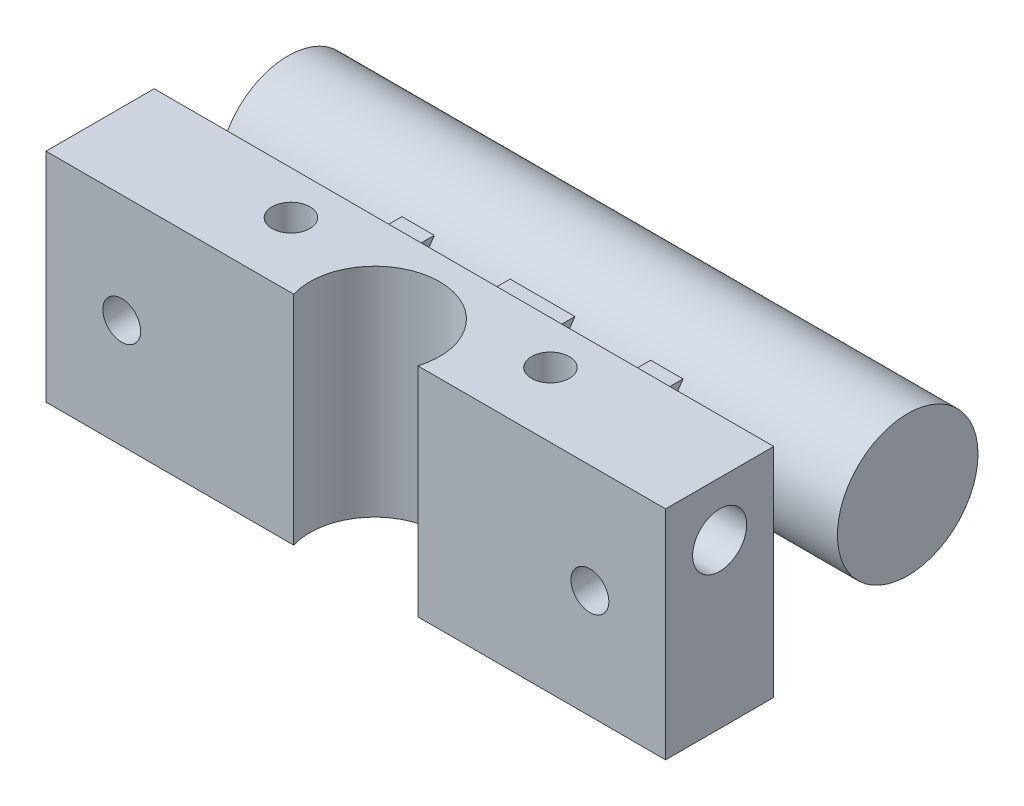
ISO-10303-21;
HEADER;
FILE_DESCRIPTION(('STEP AP214'),'2;1');
FILE_NAME('part.step','',(''),(''),'','','');
FILE_SCHEMA(('AUTOMOTIVE_DESIGN { 1 0 10303 214 1 1 1 1 }'));
ENDSEC;
DATA;
#1=APPLICATION_CONTEXT('core data for automotive mechanical design processes');
#2=APPLICATION_PROTOCOL_DEFINITION('international standard','automotive_design',2000,#1);
#3=PRODUCT_CONTEXT('',#1,'mechanical');
#4=PRODUCT('Part','Part','',(#3));
#5=PRODUCT_RELATED_PRODUCT_CATEGORY('part','',(#4));
#6=PRODUCT_DEFINITION_FORMATION('','',#4);
#7=PRODUCT_DEFINITION_CONTEXT('part definition',#1,'design');
#8=PRODUCT_DEFINITION('design','',#6,#7);
#9=PRODUCT_DEFINITION_SHAPE('','',#8);
#10=(LENGTH_UNIT() NAMED_UNIT(*) SI_UNIT(.MILLI.,.METRE.));
#11=(NAMED_UNIT(*) PLANE_ANGLE_UNIT() SI_UNIT($,.RADIAN.));
#12=(NAMED_UNIT(*) SI_UNIT($,.STERADIAN.) SOLID_ANGLE_UNIT());
#13=UNCERTAINTY_MEASURE_WITH_UNIT(LENGTH_MEASURE(1.E-05),#10,'distance_accuracy_value','');
#14=(GEOMETRIC_REPRESENTATION_CONTEXT(3) GLOBAL_UNCERTAINTY_ASSIGNED_CONTEXT((#13)) GLOBAL_UNIT_ASSIGNED_CONTEXT((#10,
#11,#12)) REPRESENTATION_CONTEXT('',''));
#15=CARTESIAN_POINT('',(0.,0.,0.));
#16=DIRECTION('',(0.,0.,1.));
#17=DIRECTION('',(1.,0.,0.));
#18=AXIS2_PLACEMENT_3D('',#15,#16,#17);
#19=CARTESIAN_POINT('',(-13.,4.,-30.));
#20=DIRECTION('',(0.,-1.,0.));
#21=DIRECTION('',(1.,0.,0.));
#22=AXIS2_PLACEMENT_3D('',#19,#20,#21);
#23=PLANE('',#22);
#24=DIRECTION('',(-1.,0.,0.));
#25=VECTOR('',#24,1.);
#26=CARTESIAN_POINT('',(28.65,3.99999999999999,-17.2665246170202));
#27=LINE('',#26,#25);
#28=CARTESIAN_POINT('',(-13.,4.,-17.2665246170202));
#29=VERTEX_POINT('',#28);
#30=CARTESIAN_POINT('',(-10.,4.,-17.2665246170202));
#31=VERTEX_POINT('',#30);
#32=EDGE_CURVE('E93',#29,#31,#27,.F.);
#33=ORIENTED_EDGE('',*,*,#32,.F.);
#34=DIRECTION('',(0.,0.,1.));
#35=VECTOR('',#34,1.);
#36=CARTESIAN_POINT('',(-13.,4.,-30.));
#37=LINE('',#36,#35);
#38=CARTESIAN_POINT('',(-13.,4.,-10.));
#39=VERTEX_POINT('',#38);
#40=EDGE_CURVE('E315',#29,#39,#37,.T.);
#41=ORIENTED_EDGE('',*,*,#40,.T.);
#42=DIRECTION('',(1.,0.,0.));
#43=VECTOR('',#42,1.);
#44=CARTESIAN_POINT('',(-13.,4.,-10.));
#45=LINE('',#44,#43);
#46=CARTESIAN_POINT('',(-10.,4.,-10.));
#47=VERTEX_POINT('',#46);
#48=EDGE_CURVE('E385',#39,#47,#45,.T.);
#49=ORIENTED_EDGE('',*,*,#48,.T.);
#50=DIRECTION('',(0.,0.,1.));
#51=VECTOR('',#50,1.);
#52=CARTESIAN_POINT('',(-10.,4.,-30.));
#53=LINE('',#52,#51);
#54=EDGE_CURVE('E368',#31,#47,#53,.T.);
#55=ORIENTED_EDGE('',*,*,#54,.F.);
#56=EDGE_LOOP('',(#33,#41,#49,#55));
#57=FACE_BOUND('',#56,.T.);
#58=ADVANCED_FACE('F77',(#57),#23,.F.);
#59=CARTESIAN_POINT('',(3.,4.,-30.));
#60=DIRECTION('',(0.,-1.,0.));
#61=DIRECTION('',(0.,0.,-1.));
#62=AXIS2_PLACEMENT_3D('',#59,#60,#61);
#63=PLANE('',#62);
#64=DIRECTION('',(-1.,0.,0.));
#65=VECTOR('',#64,1.);
#66=CARTESIAN_POINT('',(28.65,4.,-17.2665246170202));
#67=LINE('',#66,#65);
#68=CARTESIAN_POINT('',(-3.,4.,-17.2665246170202));
#69=VERTEX_POINT('',#68);
#70=CARTESIAN_POINT('',(3.,4.,-17.2665246170202));
#71=VERTEX_POINT('',#70);
#72=EDGE_CURVE('E246',#69,#71,#67,.F.);
#73=ORIENTED_EDGE('',*,*,#72,.F.);
#74=DIRECTION('',(0.,0.,1.));
#75=VECTOR('',#74,1.);
#76=CARTESIAN_POINT('',(-3.,4.,-30.));
#77=LINE('',#76,#75);
#78=CARTESIAN_POINT('',(-3.,4.,-10.));
#79=VERTEX_POINT('',#78);
#80=EDGE_CURVE('E338',#69,#79,#77,.T.);
#81=ORIENTED_EDGE('',*,*,#80,.T.);
#82=DIRECTION('',(1.,0.,0.));
#83=VECTOR('',#82,1.);
#84=CARTESIAN_POINT('',(3.,4.,-10.));
#85=LINE('',#84,#83);
#86=CARTESIAN_POINT('',(3.,4.,-10.));
#87=VERTEX_POINT('',#86);
#88=EDGE_CURVE('E359',#79,#87,#85,.T.);
#89=ORIENTED_EDGE('',*,*,#88,.T.);
#90=DIRECTION('',(0.,0.,1.));
#91=VECTOR('',#90,1.);
#92=CARTESIAN_POINT('',(3.,4.,-30.));
#93=LINE('',#92,#91);
#94=EDGE_CURVE('E341',#71,#87,#93,.T.);
#95=ORIENTED_EDGE('',*,*,#94,.F.);
#96=EDGE_LOOP('',(#73,#81,#89,#95));
#97=FACE_BOUND('',#96,.T.);
#98=ADVANCED_FACE('F503',(#97),#63,.F.);
#99=CARTESIAN_POINT('',(13.,4.,-30.));
#100=DIRECTION('',(0.,-1.,0.));
#101=DIRECTION('',(0.,0.,-1.));
#102=AXIS2_PLACEMENT_3D('',#99,#100,#101);
#103=PLANE('',#102);
#104=DIRECTION('',(-1.,0.,0.));
#105=VECTOR('',#104,1.);
#106=CARTESIAN_POINT('',(28.65,4.,-17.2665246170202));
#107=LINE('',#106,#105);
#108=CARTESIAN_POINT('',(10.,4.,-17.2665246170202));
#109=VERTEX_POINT('',#108);
#110=CARTESIAN_POINT('',(13.,4.,-17.2665246170202));
#111=VERTEX_POINT('',#110);
#112=EDGE_CURVE('E229',#109,#111,#107,.F.);
#113=ORIENTED_EDGE('',*,*,#112,.F.);
#114=DIRECTION('',(0.,0.,1.));
#115=VECTOR('',#114,1.);
#116=CARTESIAN_POINT('',(10.,4.,-30.));
#117=LINE('',#116,#115);
#118=CARTESIAN_POINT('',(10.,4.,-10.));
#119=VERTEX_POINT('',#118);
#120=EDGE_CURVE('E214',#109,#119,#117,.T.);
#121=ORIENTED_EDGE('',*,*,#120,.T.);
#122=DIRECTION('',(1.,0.,0.));
#123=VECTOR('',#122,1.);
#124=CARTESIAN_POINT('',(13.,4.,-10.));
#125=LINE('',#124,#123);
#126=CARTESIAN_POINT('',(13.,4.,-10.));
#127=VERTEX_POINT('',#126);
#128=EDGE_CURVE('E326',#119,#127,#125,.T.);
#129=ORIENTED_EDGE('',*,*,#128,.T.);
#130=DIRECTION('',(0.,0.,1.));
#131=VECTOR('',#130,1.);
#132=CARTESIAN_POINT('',(13.,4.,-30.));
#133=LINE('',#132,#131);
#134=EDGE_CURVE('E330',#111,#127,#133,.T.);
#135=ORIENTED_EDGE('',*,*,#134,.F.);
#136=EDGE_LOOP('',(#113,#121,#129,#135));
#137=FACE_BOUND('',#136,.T.);
#138=ADVANCED_FACE('F509',(#137),#103,.F.);
#139=CARTESIAN_POINT('',(-13.,-4.,-30.));
#140=DIRECTION('',(0.,1.,0.));
#141=DIRECTION('',(-1.,0.,0.));
#142=AXIS2_PLACEMENT_3D('',#139,#140,#141);
#143=PLANE('',#142);
#144=DIRECTION('',(-1.,0.,0.));
#145=VECTOR('',#144,1.);
#146=CARTESIAN_POINT('',(28.65,-4.00000000000001,-17.2665246170202));
#147=LINE('',#146,#145);
#148=CARTESIAN_POINT('',(-10.,-4.,-17.2665246170202));
#149=VERTEX_POINT('',#148);
#150=CARTESIAN_POINT('',(-13.,-4.00000000000001,-17.2665246170202));
#151=VERTEX_POINT('',#150);
#152=EDGE_CURVE('E254',#149,#151,#147,.T.);
#153=ORIENTED_EDGE('',*,*,#152,.F.);
#154=DIRECTION('',(0.,0.,1.));
#155=VECTOR('',#154,1.);
#156=CARTESIAN_POINT('',(-10.,-4.,-30.));
#157=LINE('',#156,#155);
#158=CARTESIAN_POINT('',(-10.,-4.,-10.));
#159=VERTEX_POINT('',#158);
#160=EDGE_CURVE('E371',#149,#159,#157,.T.);
#161=ORIENTED_EDGE('',*,*,#160,.T.);
#162=DIRECTION('',(-1.,0.,0.));
#163=VECTOR('',#162,1.);
#164=CARTESIAN_POINT('',(-13.,-4.,-10.));
#165=LINE('',#164,#163);
#166=CARTESIAN_POINT('',(-13.,-4.,-10.));
#167=VERTEX_POINT('',#166);
#168=EDGE_CURVE('E377',#159,#167,#165,.T.);
#169=ORIENTED_EDGE('',*,*,#168,.T.);
#170=DIRECTION('',(0.,0.,1.));
#171=VECTOR('',#170,1.);
#172=CARTESIAN_POINT('',(-13.,-4.,-30.));
#173=LINE('',#172,#171);
#174=EDGE_CURVE('E374',#151,#167,#173,.T.);
#175=ORIENTED_EDGE('',*,*,#174,.F.);
#176=EDGE_LOOP('',(#153,#161,#169,#175));
#177=FACE_BOUND('',#176,.T.);
#178=ADVANCED_FACE('F520',(#177),#143,.F.);
#179=CARTESIAN_POINT('',(3.,-4.,-30.));
#180=DIRECTION('',(0.,1.,0.));
#181=DIRECTION('',(0.,0.,1.));
#182=AXIS2_PLACEMENT_3D('',#179,#180,#181);
#183=PLANE('',#182);
#184=DIRECTION('',(-1.,0.,0.));
#185=VECTOR('',#184,1.);
#186=CARTESIAN_POINT('',(28.65,-4.,-17.2665246170202));
#187=LINE('',#186,#185);
#188=CARTESIAN_POINT('',(3.,-4.,-17.2665246170202));
#189=VERTEX_POINT('',#188);
#190=CARTESIAN_POINT('',(-3.,-4.,-17.2665246170202));
#191=VERTEX_POINT('',#190);
#192=EDGE_CURVE('E235',#189,#191,#187,.T.);
#193=ORIENTED_EDGE('',*,*,#192,.F.);
#194=DIRECTION('',(0.,0.,1.));
#195=VECTOR('',#194,1.);
#196=CARTESIAN_POINT('',(3.,-4.,-30.));
#197=LINE('',#196,#195);
#198=CARTESIAN_POINT('',(3.,-4.,-10.));
#199=VERTEX_POINT('',#198);
#200=EDGE_CURVE('E345',#189,#199,#197,.T.);
#201=ORIENTED_EDGE('',*,*,#200,.T.);
#202=DIRECTION('',(-1.,0.,0.));
#203=VECTOR('',#202,1.);
#204=CARTESIAN_POINT('',(3.,-4.,-10.));
#205=LINE('',#204,#203);
#206=CARTESIAN_POINT('',(-3.,-4.,-10.));
#207=VERTEX_POINT('',#206);
#208=EDGE_CURVE('E351',#199,#207,#205,.T.);
#209=ORIENTED_EDGE('',*,*,#208,.T.);
#210=DIRECTION('',(0.,0.,1.));
#211=VECTOR('',#210,1.);
#212=CARTESIAN_POINT('',(-3.,-4.,-30.));
#213=LINE('',#212,#211);
#214=EDGE_CURVE('E348',#191,#207,#213,.T.);
#215=ORIENTED_EDGE('',*,*,#214,.F.);
#216=EDGE_LOOP('',(#193,#201,#209,#215));
#217=FACE_BOUND('',#216,.T.);
#218=ADVANCED_FACE('F522',(#217),#183,.F.);
#219=CARTESIAN_POINT('',(13.,-4.,-30.));
#220=DIRECTION('',(0.,1.,0.));
#221=DIRECTION('',(0.,0.,1.));
#222=AXIS2_PLACEMENT_3D('',#219,#220,#221);
#223=PLANE('',#222);
#224=DIRECTION('',(-1.,0.,0.));
#225=VECTOR('',#224,1.);
#226=CARTESIAN_POINT('',(28.65,-4.,-17.2665246170202));
#227=LINE('',#226,#225);
#228=CARTESIAN_POINT('',(13.,-4.,-17.2665246170202));
#229=VERTEX_POINT('',#228);
#230=CARTESIAN_POINT('',(10.,-4.,-17.2665246170202));
#231=VERTEX_POINT('',#230);
#232=EDGE_CURVE('E12',#229,#231,#227,.T.);
#233=ORIENTED_EDGE('',*,*,#232,.F.);
#234=DIRECTION('',(0.,0.,1.));
#235=VECTOR('',#234,1.);
#236=CARTESIAN_POINT('',(13.,-4.,-30.));
#237=LINE('',#236,#235);
#238=CARTESIAN_POINT('',(13.,-4.,-10.));
#239=VERTEX_POINT('',#238);
#240=EDGE_CURVE('E213',#229,#239,#237,.T.);
#241=ORIENTED_EDGE('',*,*,#240,.T.);
#242=DIRECTION('',(-1.,0.,0.));
#243=VECTOR('',#242,1.);
#244=CARTESIAN_POINT('',(13.,-4.,-10.));
#245=LINE('',#244,#243);
#246=CARTESIAN_POINT('',(10.,-4.,-10.));
#247=VERTEX_POINT('',#246);
#248=EDGE_CURVE('E208',#239,#247,#245,.T.);
#249=ORIENTED_EDGE('',*,*,#248,.T.);
#250=DIRECTION('',(0.,0.,1.));
#251=VECTOR('',#250,1.);
#252=CARTESIAN_POINT('',(10.,-4.,-30.));
#253=LINE('',#252,#251);
#254=EDGE_CURVE('E203',#231,#247,#253,.T.);
#255=ORIENTED_EDGE('',*,*,#254,.F.);
#256=EDGE_LOOP('',(#233,#241,#249,#255));
#257=FACE_BOUND('',#256,.T.);
#258=ADVANCED_FACE('F205',(#257),#223,.F.);
#259=CARTESIAN_POINT('',(0.,0.,0.));
#260=DIRECTION('',(0.,0.,1.));
#261=DIRECTION('',(1.,0.,0.));
#262=AXIS2_PLACEMENT_3D('',#259,#260,#261);
#263=PLANE('',#262);
#264=DIRECTION('',(0.,1.,0.));
#265=VECTOR('',#264,1.);
#266=CARTESIAN_POINT('',(5.7391201416245,-10.05,0.));
#267=LINE('',#266,#265);
#268=CARTESIAN_POINT('',(5.7391201416245,-10.05,0.));
#269=VERTEX_POINT('',#268);
#270=CARTESIAN_POINT('',(5.7391201416245,10.05,0.));
#271=VERTEX_POINT('',#270);
#272=EDGE_CURVE('E86',#269,#271,#267,.T.);
#273=ORIENTED_EDGE('',*,*,#272,.F.);
#274=DIRECTION('',(1.,0.,0.));
#275=VECTOR('',#274,1.);
#276=CARTESIAN_POINT('',(-28.65,-10.05,0.));
#277=LINE('',#276,#275);
#278=CARTESIAN_POINT('',(28.65,-10.05,0.));
#279=VERTEX_POINT('',#278);
#280=EDGE_CURVE('E337',#269,#279,#277,.T.);
#281=ORIENTED_EDGE('',*,*,#280,.T.);
#282=DIRECTION('',(0.,1.,0.));
#283=VECTOR('',#282,1.);
#284=CARTESIAN_POINT('',(28.65,-10.05,0.));
#285=LINE('',#284,#283);
#286=CARTESIAN_POINT('',(28.65,10.05,0.));
#287=VERTEX_POINT('',#286);
#288=EDGE_CURVE('E414',#279,#287,#285,.T.);
#289=ORIENTED_EDGE('',*,*,#288,.T.);
#290=DIRECTION('',(-1.,0.,0.));
#291=VECTOR('',#290,1.);
#292=CARTESIAN_POINT('',(28.65,10.05,0.));
#293=LINE('',#292,#291);
#294=EDGE_CURVE('E419',#287,#271,#293,.T.);
#295=ORIENTED_EDGE('',*,*,#294,.T.);
#296=EDGE_LOOP('',(#273,#281,#289,#295));
#297=FACE_BOUND('',#296,.T.);
#298=CARTESIAN_POINT('',(21.65,0.,0.));
#299=DIRECTION('',(0.,0.,-1.));
#300=DIRECTION('',(-1.,0.,0.));
#301=AXIS2_PLACEMENT_3D('',#298,#299,#300);
#302=CIRCLE('',#301,1.75);
#303=CARTESIAN_POINT('',(19.9,0.,0.));
#304=VERTEX_POINT('',#303);
#305=EDGE_CURVE('E298',#304,#304,#302,.T.);
#306=ORIENTED_EDGE('',*,*,#305,.T.);
#307=EDGE_LOOP('',(#306));
#308=FACE_BOUND('',#307,.T.);
#309=ADVANCED_FACE('F468',(#297,#308),#263,.T.);
#310=CARTESIAN_POINT('',(-13.,4.,-30.));
#311=DIRECTION('',(1.,0.,0.));
#312=DIRECTION('',(0.,1.,0.));
#313=AXIS2_PLACEMENT_3D('',#310,#311,#312);
#314=PLANE('',#313);
#315=CARTESIAN_POINT('',(-13.,0.,-22.39));
#316=DIRECTION('',(1.,0.,0.));
#317=DIRECTION('',(0.,1.,0.));
#318=AXIS2_PLACEMENT_3D('',#315,#316,#317);
#319=CIRCLE('',#318,6.50000000000001);
#320=EDGE_CURVE('E262',#151,#29,#319,.F.);
#321=ORIENTED_EDGE('',*,*,#320,.F.);
#322=ORIENTED_EDGE('',*,*,#174,.T.);
#323=DIRECTION('',(0.,1.,0.));
#324=VECTOR('',#323,1.);
#325=CARTESIAN_POINT('',(-13.,4.,-10.));
#326=LINE('',#325,#324);
#327=EDGE_CURVE('E342',#167,#39,#326,.T.);
#328=ORIENTED_EDGE('',*,*,#327,.T.);
#329=ORIENTED_EDGE('',*,*,#40,.F.);
#330=EDGE_LOOP('',(#321,#322,#328,#329));
#331=FACE_BOUND('',#330,.T.);
#332=ADVANCED_FACE('F514',(#331),#314,.F.);
#333=CARTESIAN_POINT('',(-10.,4.,-30.));
#334=DIRECTION('',(-1.,0.,0.));
#335=DIRECTION('',(0.,-1.,0.));
#336=AXIS2_PLACEMENT_3D('',#333,#334,#335);
#337=PLANE('',#336);
#338=CARTESIAN_POINT('',(-10.,0.,-22.39));
#339=DIRECTION('',(-1.,0.,0.));
#340=DIRECTION('',(0.,-1.,0.));
#341=AXIS2_PLACEMENT_3D('',#338,#339,#340);
#342=CIRCLE('',#341,6.50000000000001);
#343=EDGE_CURVE('E101',#31,#149,#342,.F.);
#344=ORIENTED_EDGE('',*,*,#343,.F.);
#345=ORIENTED_EDGE('',*,*,#54,.T.);
#346=DIRECTION('',(0.,-1.,0.));
#347=VECTOR('',#346,1.);
#348=CARTESIAN_POINT('',(-10.,4.,-10.));
#349=LINE('',#348,#347);
#350=EDGE_CURVE('E381',#47,#159,#349,.T.);
#351=ORIENTED_EDGE('',*,*,#350,.T.);
#352=ORIENTED_EDGE('',*,*,#160,.F.);
#353=EDGE_LOOP('',(#344,#345,#351,#352));
#354=FACE_BOUND('',#353,.T.);
#355=ADVANCED_FACE('F516',(#354),#337,.F.);
#356=CARTESIAN_POINT('',(-3.,4.,-30.));
#357=DIRECTION('',(1.,0.,0.));
#358=DIRECTION('',(0.,0.,-1.));
#359=AXIS2_PLACEMENT_3D('',#356,#357,#358);
#360=PLANE('',#359);
#361=CARTESIAN_POINT('',(-3.,0.,-22.39));
#362=DIRECTION('',(1.,0.,0.));
#363=DIRECTION('',(0.,0.,-1.));
#364=AXIS2_PLACEMENT_3D('',#361,#362,#363);
#365=CIRCLE('',#364,6.50000000000001);
#366=EDGE_CURVE('E250',#191,#69,#365,.F.);
#367=ORIENTED_EDGE('',*,*,#366,.F.);
#368=ORIENTED_EDGE('',*,*,#214,.T.);
#369=DIRECTION('',(0.,1.,0.));
#370=VECTOR('',#369,1.);
#371=CARTESIAN_POINT('',(-3.,4.,-10.));
#372=LINE('',#371,#370);
#373=EDGE_CURVE('E320',#207,#79,#372,.T.);
#374=ORIENTED_EDGE('',*,*,#373,.T.);
#375=ORIENTED_EDGE('',*,*,#80,.F.);
#376=EDGE_LOOP('',(#367,#368,#374,#375));
#377=FACE_BOUND('',#376,.T.);
#378=ADVANCED_FACE('F519',(#377),#360,.F.);
#379=CARTESIAN_POINT('',(3.,4.,-30.));
#380=DIRECTION('',(-1.,0.,0.));
#381=DIRECTION('',(0.,0.,1.));
#382=AXIS2_PLACEMENT_3D('',#379,#380,#381);
#383=PLANE('',#382);
#384=CARTESIAN_POINT('',(3.,0.,-22.39));
#385=DIRECTION('',(-1.,0.,0.));
#386=DIRECTION('',(0.,0.,1.));
#387=AXIS2_PLACEMENT_3D('',#384,#385,#386);
#388=CIRCLE('',#387,6.50000000000001);
#389=EDGE_CURVE('E242',#71,#189,#388,.F.);
#390=ORIENTED_EDGE('',*,*,#389,.F.);
#391=ORIENTED_EDGE('',*,*,#94,.T.);
#392=DIRECTION('',(0.,-1.,0.));
#393=VECTOR('',#392,1.);
#394=CARTESIAN_POINT('',(3.,4.,-10.));
#395=LINE('',#394,#393);
#396=EDGE_CURVE('E355',#87,#199,#395,.T.);
#397=ORIENTED_EDGE('',*,*,#396,.T.);
#398=ORIENTED_EDGE('',*,*,#200,.F.);
#399=EDGE_LOOP('',(#390,#391,#397,#398));
#400=FACE_BOUND('',#399,.T.);
#401=ADVANCED_FACE('F572',(#400),#383,.F.);
#402=CARTESIAN_POINT('',(13.,4.,-30.));
#403=DIRECTION('',(-1.,0.,0.));
#404=DIRECTION('',(0.,0.,1.));
#405=AXIS2_PLACEMENT_3D('',#402,#403,#404);
#406=PLANE('',#405);
#407=CARTESIAN_POINT('',(13.,0.,-22.39));
#408=DIRECTION('',(-1.,0.,0.));
#409=DIRECTION('',(0.,0.,1.));
#410=AXIS2_PLACEMENT_3D('',#407,#408,#409);
#411=CIRCLE('',#410,6.50000000000001);
#412=EDGE_CURVE('E223',#111,#229,#411,.F.);
#413=ORIENTED_EDGE('',*,*,#412,.F.);
#414=ORIENTED_EDGE('',*,*,#134,.T.);
#415=DIRECTION('',(0.,-1.,0.));
#416=VECTOR('',#415,1.);
#417=CARTESIAN_POINT('',(13.,4.,-10.));
#418=LINE('',#417,#416);
#419=EDGE_CURVE('E316',#127,#239,#418,.T.);
#420=ORIENTED_EDGE('',*,*,#419,.T.);
#421=ORIENTED_EDGE('',*,*,#240,.F.);
#422=EDGE_LOOP('',(#413,#414,#420,#421));
#423=FACE_BOUND('',#422,.T.);
#424=ADVANCED_FACE('F567',(#423),#406,.F.);
#425=CARTESIAN_POINT('',(10.,4.,-30.));
#426=DIRECTION('',(1.,0.,0.));
#427=DIRECTION('',(0.,0.,-1.));
#428=AXIS2_PLACEMENT_3D('',#425,#426,#427);
#429=PLANE('',#428);
#430=CARTESIAN_POINT('',(10.,0.,-22.39));
#431=DIRECTION('',(1.,0.,0.));
#432=DIRECTION('',(0.,0.,-1.));
#433=AXIS2_PLACEMENT_3D('',#430,#431,#432);
#434=CIRCLE('',#433,6.50000000000001);
#435=EDGE_CURVE('E218',#231,#109,#434,.F.);
#436=ORIENTED_EDGE('',*,*,#435,.F.);
#437=ORIENTED_EDGE('',*,*,#254,.T.);
#438=DIRECTION('',(0.,1.,0.));
#439=VECTOR('',#438,1.);
#440=CARTESIAN_POINT('',(10.,4.,-10.));
#441=LINE('',#440,#439);
#442=EDGE_CURVE('E323',#247,#119,#441,.T.);
#443=ORIENTED_EDGE('',*,*,#442,.T.);
#444=ORIENTED_EDGE('',*,*,#120,.F.);
#445=EDGE_LOOP('',(#436,#437,#443,#444));
#446=FACE_BOUND('',#445,.T.);
#447=ADVANCED_FACE('F219',(#446),#429,.F.);
#448=CARTESIAN_POINT('',(0.,0.,-10.));
#449=DIRECTION('',(0.,0.,1.));
#450=DIRECTION('',(1.,0.,0.));
#451=AXIS2_PLACEMENT_3D('',#448,#449,#450);
#452=PLANE('',#451);
#453=CARTESIAN_POINT('',(21.65,0.,-10.));
#454=DIRECTION('',(0.,0.,1.));
#455=DIRECTION('',(1.,0.,0.));
#456=AXIS2_PLACEMENT_3D('',#453,#454,#455);
#457=CIRCLE('',#456,1.75);
#458=CARTESIAN_POINT('',(23.4,0.,-10.));
#459=VERTEX_POINT('',#458);
#460=EDGE_CURVE('E311',#459,#459,#457,.T.);
#461=ORIENTED_EDGE('',*,*,#460,.T.);
#462=EDGE_LOOP('',(#461));
#463=FACE_BOUND('',#462,.T.);
#464=CARTESIAN_POINT('',(-21.65,0.,-10.));
#465=DIRECTION('',(0.,0.,1.));
#466=DIRECTION('',(1.,0.,0.));
#467=AXIS2_PLACEMENT_3D('',#464,#465,#466);
#468=CIRCLE('',#467,1.75);
#469=CARTESIAN_POINT('',(-19.9,0.,-10.));
#470=VERTEX_POINT('',#469);
#471=EDGE_CURVE('E302',#470,#470,#468,.T.);
#472=ORIENTED_EDGE('',*,*,#471,.T.);
#473=EDGE_LOOP('',(#472));
#474=FACE_BOUND('',#473,.T.);
#475=ORIENTED_EDGE('',*,*,#373,.F.);
#476=ORIENTED_EDGE('',*,*,#208,.F.);
#477=ORIENTED_EDGE('',*,*,#396,.F.);
#478=ORIENTED_EDGE('',*,*,#88,.F.);
#479=EDGE_LOOP('',(#475,#476,#477,#478));
#480=FACE_BOUND('',#479,.T.);
#481=DIRECTION('',(1.,0.,0.));
#482=VECTOR('',#481,1.);
#483=CARTESIAN_POINT('',(-28.65,-10.05,-10.));
#484=LINE('',#483,#482);
#485=CARTESIAN_POINT('',(-28.65,-10.05,-10.));
#486=VERTEX_POINT('',#485);
#487=CARTESIAN_POINT('',(28.65,-10.05,-10.));
#488=VERTEX_POINT('',#487);
#489=EDGE_CURVE('E392',#486,#488,#484,.T.);
#490=ORIENTED_EDGE('',*,*,#489,.F.);
#491=DIRECTION('',(0.,-1.,0.));
#492=VECTOR('',#491,1.);
#493=CARTESIAN_POINT('',(-28.65,10.05,-10.));
#494=LINE('',#493,#492);
#495=CARTESIAN_POINT('',(-28.65,10.05,-10.));
#496=VERTEX_POINT('',#495);
#497=EDGE_CURVE('E405',#496,#486,#494,.T.);
#498=ORIENTED_EDGE('',*,*,#497,.F.);
#499=DIRECTION('',(-1.,0.,0.));
#500=VECTOR('',#499,1.);
#501=CARTESIAN_POINT('',(28.65,10.05,-10.));
#502=LINE('',#501,#500);
#503=CARTESIAN_POINT('',(28.65,10.05,-10.));
#504=VERTEX_POINT('',#503);
#505=EDGE_CURVE('E401',#504,#496,#502,.T.);
#506=ORIENTED_EDGE('',*,*,#505,.F.);
#507=DIRECTION('',(0.,1.,0.));
#508=VECTOR('',#507,1.);
#509=CARTESIAN_POINT('',(28.65,-10.05,-10.));
#510=LINE('',#509,#508);
#511=EDGE_CURVE('E396',#488,#504,#510,.T.);
#512=ORIENTED_EDGE('',*,*,#511,.F.);
#513=EDGE_LOOP('',(#490,#498,#506,#512));
#514=FACE_BOUND('',#513,.T.);
#515=ORIENTED_EDGE('',*,*,#327,.F.);
#516=ORIENTED_EDGE('',*,*,#168,.F.);
#517=ORIENTED_EDGE('',*,*,#350,.F.);
#518=ORIENTED_EDGE('',*,*,#48,.F.);
#519=EDGE_LOOP('',(#515,#516,#517,#518));
#520=FACE_BOUND('',#519,.T.);
#521=ORIENTED_EDGE('',*,*,#419,.F.);
#522=ORIENTED_EDGE('',*,*,#128,.F.);
#523=ORIENTED_EDGE('',*,*,#442,.F.);
#524=ORIENTED_EDGE('',*,*,#248,.F.);
#525=EDGE_LOOP('',(#521,#522,#523,#524));
#526=FACE_BOUND('',#525,.T.);
#527=ADVANCED_FACE('F478',(#463,#474,#480,#514,#520,#526),#452,.F.);
#528=CARTESIAN_POINT('',(-28.65,-10.05,-10.));
#529=DIRECTION('',(0.,-1.,0.));
#530=DIRECTION('',(0.,0.,-1.));
#531=AXIS2_PLACEMENT_3D('',#528,#529,#530);
#532=PLANE('',#531);
#533=CARTESIAN_POINT('',(-12.,-10.05,-6.));
#534=DIRECTION('',(0.,1.,0.));
#535=DIRECTION('',(0.,0.,1.));
#536=AXIS2_PLACEMENT_3D('',#533,#534,#535);
#537=CIRCLE('',#536,1.75);
#538=CARTESIAN_POINT('',(-12.,-10.05,-4.25));
#539=VERTEX_POINT('',#538);
#540=EDGE_CURVE('E283',#539,#539,#537,.T.);
#541=ORIENTED_EDGE('',*,*,#540,.T.);
#542=EDGE_LOOP('',(#541));
#543=FACE_BOUND('',#542,.T.);
#544=CARTESIAN_POINT('',(12.,-10.05,-6.));
#545=DIRECTION('',(0.,1.,0.));
#546=DIRECTION('',(0.,0.,1.));
#547=AXIS2_PLACEMENT_3D('',#544,#545,#546);
#548=CIRCLE('',#547,1.75);
#549=CARTESIAN_POINT('',(12.,-10.05,-4.25));
#550=VERTEX_POINT('',#549);
#551=EDGE_CURVE('E288',#550,#550,#548,.T.);
#552=ORIENTED_EDGE('',*,*,#551,.T.);
#553=EDGE_LOOP('',(#552));
#554=FACE_BOUND('',#553,.T.);
#555=CARTESIAN_POINT('',(0.,-10.05,-1.75));
#556=DIRECTION('',(0.,1.,0.));
#557=DIRECTION('',(0.,0.,1.));
#558=AXIS2_PLACEMENT_3D('',#555,#556,#557);
#559=CIRCLE('',#558,6.);
#560=CARTESIAN_POINT('',(-5.7391201416245,-10.05,0.));
#561=VERTEX_POINT('',#560);
#562=EDGE_CURVE('E279',#269,#561,#559,.T.);
#563=ORIENTED_EDGE('',*,*,#562,.T.);
#564=CARTESIAN_POINT('',(-28.65,-10.05,0.));
#565=VERTEX_POINT('',#564);
#566=EDGE_CURVE('E410',#565,#561,#277,.T.);
#567=ORIENTED_EDGE('',*,*,#566,.F.);
#568=DIRECTION('',(0.,0.,1.));
#569=VECTOR('',#568,1.);
#570=CARTESIAN_POINT('',(-28.65,-10.05,-10.));
#571=LINE('',#570,#569);
#572=EDGE_CURVE('E426',#486,#565,#571,.T.);
#573=ORIENTED_EDGE('',*,*,#572,.F.);
#574=ORIENTED_EDGE('',*,*,#489,.T.);
#575=DIRECTION('',(0.,0.,1.));
#576=VECTOR('',#575,1.);
#577=CARTESIAN_POINT('',(28.65,-10.05,-10.));
#578=LINE('',#577,#576);
#579=EDGE_CURVE('E409',#488,#279,#578,.T.);
#580=ORIENTED_EDGE('',*,*,#579,.T.);
#581=ORIENTED_EDGE('',*,*,#280,.F.);
#582=EDGE_LOOP('',(#563,#567,#573,#574,#580,#581));
#583=FACE_BOUND('',#582,.T.);
#584=ADVANCED_FACE('F79',(#543,#554,#583),#532,.T.);
#585=CARTESIAN_POINT('',(-28.65,10.05,-10.));
#586=DIRECTION('',(-1.,0.,0.));
#587=DIRECTION('',(0.,0.,1.));
#588=AXIS2_PLACEMENT_3D('',#585,#586,#587);
#589=PLANE('',#588);
#590=CARTESIAN_POINT('',(-28.65,5.05,-5.));
#591=DIRECTION('',(1.,0.,0.));
#592=DIRECTION('',(0.,0.,-1.));
#593=AXIS2_PLACEMENT_3D('',#590,#591,#592);
#594=CIRCLE('',#593,2.5);
#595=CARTESIAN_POINT('',(-28.65,5.05,-7.5));
#596=VERTEX_POINT('',#595);
#597=EDGE_CURVE('E266',#596,#596,#594,.T.);
#598=ORIENTED_EDGE('',*,*,#597,.T.);
#599=EDGE_LOOP('',(#598));
#600=FACE_BOUND('',#599,.T.);
#601=DIRECTION('',(0.,-1.,0.));
#602=VECTOR('',#601,1.);
#603=CARTESIAN_POINT('',(-28.65,10.05,0.));
#604=LINE('',#603,#602);
#605=CARTESIAN_POINT('',(-28.65,10.05,0.));
#606=VERTEX_POINT('',#605);
#607=EDGE_CURVE('E397',#606,#565,#604,.T.);
#608=ORIENTED_EDGE('',*,*,#607,.F.);
#609=DIRECTION('',(0.,0.,1.));
#610=VECTOR('',#609,1.);
#611=CARTESIAN_POINT('',(-28.65,10.05,-10.));
#612=LINE('',#611,#610);
#613=EDGE_CURVE('E430',#496,#606,#612,.T.);
#614=ORIENTED_EDGE('',*,*,#613,.F.);
#615=ORIENTED_EDGE('',*,*,#497,.T.);
#616=ORIENTED_EDGE('',*,*,#572,.T.);
#617=EDGE_LOOP('',(#608,#614,#615,#616));
#618=FACE_BOUND('',#617,.T.);
#619=ADVANCED_FACE('F457',(#600,#618),#589,.T.);
#620=CARTESIAN_POINT('',(28.65,10.05,-10.));
#621=DIRECTION('',(0.,1.,0.));
#622=DIRECTION('',(0.,0.,1.));
#623=AXIS2_PLACEMENT_3D('',#620,#621,#622);
#624=PLANE('',#623);
#625=CARTESIAN_POINT('',(-12.,10.05,-6.));
#626=DIRECTION('',(0.,1.,0.));
#627=DIRECTION('',(0.,0.,1.));
#628=AXIS2_PLACEMENT_3D('',#625,#626,#627);
#629=CIRCLE('',#628,1.75);
#630=CARTESIAN_POINT('',(-12.,10.05,-4.25));
#631=VERTEX_POINT('',#630);
#632=EDGE_CURVE('E307',#631,#631,#629,.T.);
#633=ORIENTED_EDGE('',*,*,#632,.F.);
#634=EDGE_LOOP('',(#633));
#635=FACE_BOUND('',#634,.T.);
#636=CARTESIAN_POINT('',(12.,10.05,-6.));
#637=DIRECTION('',(0.,1.,0.));
#638=DIRECTION('',(0.,0.,1.));
#639=AXIS2_PLACEMENT_3D('',#636,#637,#638);
#640=CIRCLE('',#639,1.75);
#641=CARTESIAN_POINT('',(12.,10.05,-4.25));
#642=VERTEX_POINT('',#641);
#643=EDGE_CURVE('E297',#642,#642,#640,.T.);
#644=ORIENTED_EDGE('',*,*,#643,.F.);
#645=EDGE_LOOP('',(#644));
#646=FACE_BOUND('',#645,.T.);
#647=CARTESIAN_POINT('',(0.,10.05,-1.75));
#648=DIRECTION('',(0.,1.,0.));
#649=DIRECTION('',(0.,0.,1.));
#650=AXIS2_PLACEMENT_3D('',#647,#648,#649);
#651=CIRCLE('',#650,6.);
#652=CARTESIAN_POINT('',(-5.7391201416245,10.05,0.));
#653=VERTEX_POINT('',#652);
#654=EDGE_CURVE('E287',#271,#653,#651,.T.);
#655=ORIENTED_EDGE('',*,*,#654,.F.);
#656=ORIENTED_EDGE('',*,*,#294,.F.);
#657=DIRECTION('',(0.,0.,1.));
#658=VECTOR('',#657,1.);
#659=CARTESIAN_POINT('',(28.65,10.05,-10.));
#660=LINE('',#659,#658);
#661=EDGE_CURVE('E434',#504,#287,#660,.T.);
#662=ORIENTED_EDGE('',*,*,#661,.F.);
#663=ORIENTED_EDGE('',*,*,#505,.T.);
#664=ORIENTED_EDGE('',*,*,#613,.T.);
#665=EDGE_CURVE('E418',#653,#606,#293,.T.);
#666=ORIENTED_EDGE('',*,*,#665,.F.);
#667=EDGE_LOOP('',(#655,#656,#662,#663,#664,#666));
#668=FACE_BOUND('',#667,.T.);
#669=ADVANCED_FACE('F453',(#635,#646,#668),#624,.T.);
#670=CARTESIAN_POINT('',(28.65,-10.05,-10.));
#671=DIRECTION('',(1.,0.,0.));
#672=DIRECTION('',(0.,0.,-1.));
#673=AXIS2_PLACEMENT_3D('',#670,#671,#672);
#674=PLANE('',#673);
#675=CARTESIAN_POINT('',(28.65,5.05,-5.));
#676=DIRECTION('',(1.,0.,0.));
#677=DIRECTION('',(0.,0.,-1.));
#678=AXIS2_PLACEMENT_3D('',#675,#676,#677);
#679=CIRCLE('',#678,2.5);
#680=CARTESIAN_POINT('',(28.65,5.05,-7.5));
#681=VERTEX_POINT('',#680);
#682=EDGE_CURVE('E271',#681,#681,#679,.T.);
#683=ORIENTED_EDGE('',*,*,#682,.F.);
#684=EDGE_LOOP('',(#683));
#685=FACE_BOUND('',#684,.T.);
#686=ORIENTED_EDGE('',*,*,#288,.F.);
#687=ORIENTED_EDGE('',*,*,#579,.F.);
#688=ORIENTED_EDGE('',*,*,#511,.T.);
#689=ORIENTED_EDGE('',*,*,#661,.T.);
#690=EDGE_LOOP('',(#686,#687,#688,#689));
#691=FACE_BOUND('',#690,.T.);
#692=ADVANCED_FACE('F456',(#685,#691),#674,.T.);
#693=DIRECTION('',(0.,1.,0.));
#694=VECTOR('',#693,1.);
#695=CARTESIAN_POINT('',(-5.7391201416245,-10.05,0.));
#696=LINE('',#695,#694);
#697=EDGE_CURVE('E429',#653,#561,#696,.F.);
#698=ORIENTED_EDGE('',*,*,#697,.F.);
#699=ORIENTED_EDGE('',*,*,#665,.T.);
#700=ORIENTED_EDGE('',*,*,#607,.T.);
#701=ORIENTED_EDGE('',*,*,#566,.T.);
#702=EDGE_LOOP('',(#698,#699,#700,#701));
#703=FACE_BOUND('',#702,.T.);
#704=CARTESIAN_POINT('',(-21.65,0.,0.));
#705=DIRECTION('',(0.,0.,-1.));
#706=DIRECTION('',(-1.,0.,0.));
#707=AXIS2_PLACEMENT_3D('',#704,#705,#706);
#708=CIRCLE('',#707,1.75);
#709=CARTESIAN_POINT('',(-23.4,0.,0.));
#710=VERTEX_POINT('',#709);
#711=EDGE_CURVE('E303',#710,#710,#708,.T.);
#712=ORIENTED_EDGE('',*,*,#711,.T.);
#713=EDGE_LOOP('',(#712));
#714=FACE_BOUND('',#713,.T.);
#715=ADVANCED_FACE('F484',(#703,#714),#263,.T.);
#716=CARTESIAN_POINT('',(-21.65,0.,0.));
#717=DIRECTION('',(0.,0.,-1.));
#718=DIRECTION('',(-1.,0.,0.));
#719=AXIS2_PLACEMENT_3D('',#716,#717,#718);
#720=CYLINDRICAL_SURFACE('',#719,1.75);
#721=ORIENTED_EDGE('',*,*,#711,.F.);
#722=EDGE_LOOP('',(#721));
#723=FACE_BOUND('',#722,.T.);
#724=ORIENTED_EDGE('',*,*,#471,.F.);
#725=EDGE_LOOP('',(#724));
#726=FACE_BOUND('',#725,.T.);
#727=ADVANCED_FACE('F526',(#723,#726),#720,.F.);
#728=CARTESIAN_POINT('',(21.65,0.,0.));
#729=DIRECTION('',(0.,0.,-1.));
#730=DIRECTION('',(-1.,0.,0.));
#731=AXIS2_PLACEMENT_3D('',#728,#729,#730);
#732=CYLINDRICAL_SURFACE('',#731,1.75);
#733=ORIENTED_EDGE('',*,*,#305,.F.);
#734=EDGE_LOOP('',(#733));
#735=FACE_BOUND('',#734,.T.);
#736=ORIENTED_EDGE('',*,*,#460,.F.);
#737=EDGE_LOOP('',(#736));
#738=FACE_BOUND('',#737,.T.);
#739=ADVANCED_FACE('F555',(#735,#738),#732,.F.);
#740=CARTESIAN_POINT('',(0.,-10.05,-1.75));
#741=DIRECTION('',(0.,1.,0.));
#742=DIRECTION('',(0.,0.,1.));
#743=AXIS2_PLACEMENT_3D('',#740,#741,#742);
#744=CYLINDRICAL_SURFACE('',#743,6.);
#745=ORIENTED_EDGE('',*,*,#272,.T.);
#746=ORIENTED_EDGE('',*,*,#654,.T.);
#747=ORIENTED_EDGE('',*,*,#697,.T.);
#748=ORIENTED_EDGE('',*,*,#562,.F.);
#749=EDGE_LOOP('',(#745,#746,#747,#748));
#750=FACE_BOUND('',#749,.T.);
#751=ADVANCED_FACE('F488',(#750),#744,.F.);
#752=CARTESIAN_POINT('',(12.,-10.05,-6.));
#753=DIRECTION('',(0.,1.,0.));
#754=DIRECTION('',(0.,0.,1.));
#755=AXIS2_PLACEMENT_3D('',#752,#753,#754);
#756=CYLINDRICAL_SURFACE('',#755,1.75);
#757=ORIENTED_EDGE('',*,*,#643,.T.);
#758=EDGE_LOOP('',(#757));
#759=FACE_BOUND('',#758,.T.);
#760=ORIENTED_EDGE('',*,*,#551,.F.);
#761=EDGE_LOOP('',(#760));
#762=FACE_BOUND('',#761,.T.);
#763=ADVANCED_FACE('F545',(#759,#762),#756,.F.);
#764=CARTESIAN_POINT('',(-12.,-10.05,-6.));
#765=DIRECTION('',(0.,1.,0.));
#766=DIRECTION('',(0.,0.,1.));
#767=AXIS2_PLACEMENT_3D('',#764,#765,#766);
#768=CYLINDRICAL_SURFACE('',#767,1.75);
#769=ORIENTED_EDGE('',*,*,#632,.T.);
#770=EDGE_LOOP('',(#769));
#771=FACE_BOUND('',#770,.T.);
#772=ORIENTED_EDGE('',*,*,#540,.F.);
#773=EDGE_LOOP('',(#772));
#774=FACE_BOUND('',#773,.T.);
#775=ADVANCED_FACE('F450',(#771,#774),#768,.F.);
#776=CARTESIAN_POINT('',(18.65,5.05,-5.));
#777=DIRECTION('',(1.,0.,0.));
#778=DIRECTION('',(0.,0.,-1.));
#779=AXIS2_PLACEMENT_3D('',#776,#777,#778);
#780=CYLINDRICAL_SURFACE('',#779,2.5);
#781=CARTESIAN_POINT('',(18.65,5.05,-5.));
#782=DIRECTION('',(1.,0.,0.));
#783=DIRECTION('',(0.,0.,-1.));
#784=AXIS2_PLACEMENT_3D('',#781,#782,#783);
#785=CIRCLE('',#784,2.5);
#786=CARTESIAN_POINT('',(18.65,5.05,-7.5));
#787=VERTEX_POINT('',#786);
#788=EDGE_CURVE('E275',#787,#787,#785,.T.);
#789=ORIENTED_EDGE('',*,*,#788,.F.);
#790=EDGE_LOOP('',(#789));
#791=FACE_BOUND('',#790,.T.);
#792=ORIENTED_EDGE('',*,*,#682,.T.);
#793=EDGE_LOOP('',(#792));
#794=FACE_BOUND('',#793,.T.);
#795=ADVANCED_FACE('F535',(#791,#794),#780,.F.);
#796=CARTESIAN_POINT('',(18.65,5.05,-5.));
#797=DIRECTION('',(1.,0.,0.));
#798=DIRECTION('',(0.,0.,-1.));
#799=AXIS2_PLACEMENT_3D('',#796,#797,#798);
#800=PLANE('',#799);
#801=ORIENTED_EDGE('',*,*,#788,.T.);
#802=EDGE_LOOP('',(#801));
#803=FACE_BOUND('',#802,.T.);
#804=ADVANCED_FACE('F536',(#803),#800,.T.);
#805=CARTESIAN_POINT('',(-18.65,5.05,-5.));
#806=DIRECTION('',(-1.,0.,0.));
#807=DIRECTION('',(0.,0.,1.));
#808=AXIS2_PLACEMENT_3D('',#805,#806,#807);
#809=CYLINDRICAL_SURFACE('',#808,2.5);
#810=CARTESIAN_POINT('',(-18.65,5.05,-5.));
#811=DIRECTION('',(1.,0.,0.));
#812=DIRECTION('',(0.,0.,-1.));
#813=AXIS2_PLACEMENT_3D('',#810,#811,#812);
#814=CIRCLE('',#813,2.5);
#815=CARTESIAN_POINT('',(-18.65,5.05,-7.5));
#816=VERTEX_POINT('',#815);
#817=EDGE_CURVE('E267',#816,#816,#814,.T.);
#818=ORIENTED_EDGE('',*,*,#817,.T.);
#819=EDGE_LOOP('',(#818));
#820=FACE_BOUND('',#819,.T.);
#821=ORIENTED_EDGE('',*,*,#597,.F.);
#822=EDGE_LOOP('',(#821));
#823=FACE_BOUND('',#822,.T.);
#824=ADVANCED_FACE('F542',(#820,#823),#809,.F.);
#825=CARTESIAN_POINT('',(-18.65,5.05,-5.));
#826=DIRECTION('',(-1.,0.,0.));
#827=DIRECTION('',(0.,0.,-1.));
#828=AXIS2_PLACEMENT_3D('',#825,#826,#827);
#829=PLANE('',#828);
#830=ORIENTED_EDGE('',*,*,#817,.F.);
#831=EDGE_LOOP('',(#830));
#832=FACE_BOUND('',#831,.T.);
#833=ADVANCED_FACE('F594',(#832),#829,.T.);
#834=CARTESIAN_POINT('',(28.65,0.,-22.39));
#835=DIRECTION('',(-1.,0.,0.));
#836=DIRECTION('',(0.,0.,1.));
#837=AXIS2_PLACEMENT_3D('',#834,#835,#836);
#838=CYLINDRICAL_SURFACE('',#837,6.50000000000001);
#839=CARTESIAN_POINT('',(28.65,0.,-22.39));
#840=DIRECTION('',(1.,0.,0.));
#841=DIRECTION('',(0.,0.,-1.));
#842=AXIS2_PLACEMENT_3D('',#839,#840,#841);
#843=CIRCLE('',#842,6.50000000000001);
#844=CARTESIAN_POINT('',(28.65,0.,-28.89));
#845=VERTEX_POINT('',#844);
#846=EDGE_CURVE('E224',#845,#845,#843,.T.);
#847=ORIENTED_EDGE('',*,*,#846,.F.);
#848=EDGE_LOOP('',(#847));
#849=FACE_BOUND('',#848,.T.);
#850=CARTESIAN_POINT('',(-28.65,0.,-22.39));
#851=DIRECTION('',(1.,0.,0.));
#852=DIRECTION('',(0.,0.,-1.));
#853=AXIS2_PLACEMENT_3D('',#850,#851,#852);
#854=CIRCLE('',#853,6.50000000000001);
#855=CARTESIAN_POINT('',(-28.65,0.,-28.89));
#856=VERTEX_POINT('',#855);
#857=EDGE_CURVE('E797',#856,#856,#854,.T.);
#858=ORIENTED_EDGE('',*,*,#857,.T.);
#859=EDGE_LOOP('',(#858));
#860=FACE_BOUND('',#859,.T.);
#861=ORIENTED_EDGE('',*,*,#435,.T.);
#862=ORIENTED_EDGE('',*,*,#112,.T.);
#863=ORIENTED_EDGE('',*,*,#412,.T.);
#864=ORIENTED_EDGE('',*,*,#232,.T.);
#865=EDGE_LOOP('',(#861,#862,#863,#864));
#866=FACE_BOUND('',#865,.T.);
#867=ORIENTED_EDGE('',*,*,#192,.T.);
#868=ORIENTED_EDGE('',*,*,#366,.T.);
#869=ORIENTED_EDGE('',*,*,#72,.T.);
#870=ORIENTED_EDGE('',*,*,#389,.T.);
#871=EDGE_LOOP('',(#867,#868,#869,#870));
#872=FACE_BOUND('',#871,.T.);
#873=ORIENTED_EDGE('',*,*,#152,.T.);
#874=ORIENTED_EDGE('',*,*,#320,.T.);
#875=ORIENTED_EDGE('',*,*,#32,.T.);
#876=ORIENTED_EDGE('',*,*,#343,.T.);
#877=EDGE_LOOP('',(#873,#874,#875,#876));
#878=FACE_BOUND('',#877,.T.);
#879=ADVANCED_FACE('F227',(#849,#860,#866,#872,#878),#838,.T.);
#880=CARTESIAN_POINT('',(28.65,0.,-22.39));
#881=DIRECTION('',(1.,0.,0.));
#882=DIRECTION('',(0.,0.,-1.));
#883=AXIS2_PLACEMENT_3D('',#880,#881,#882);
#884=PLANE('',#883);
#885=ORIENTED_EDGE('',*,*,#846,.T.);
#886=EDGE_LOOP('',(#885));
#887=FACE_BOUND('',#886,.T.);
#888=ADVANCED_FACE('F593',(#887),#884,.T.);
#889=CARTESIAN_POINT('',(-28.65,0.,-22.39));
#890=DIRECTION('',(1.,0.,0.));
#891=DIRECTION('',(0.,0.,-1.));
#892=AXIS2_PLACEMENT_3D('',#889,#890,#891);
#893=PLANE('',#892);
#894=ORIENTED_EDGE('',*,*,#857,.F.);
#895=EDGE_LOOP('',(#894));
#896=FACE_BOUND('',#895,.T.);
#897=ADVANCED_FACE('F677',(#896),#893,.F.);
#898=CLOSED_SHELL('',(#58,#98,#138,#178,#218,#258,#309,#332,#355,#378,#401,#424,#447,#527,#584,
#619,#669,#692,#715,#727,#739,#751,#763,#775,#795,#804,#824,#833,#879,#888,#897));
#899=MANIFOLD_SOLID_BREP('B2',#898);
#900=ADVANCED_BREP_SHAPE_REPRESENTATION('',(#18,#899),#14);
#901=SHAPE_DEFINITION_REPRESENTATION(#9,#900);
ENDSEC;
END-ISO-10303-21;
